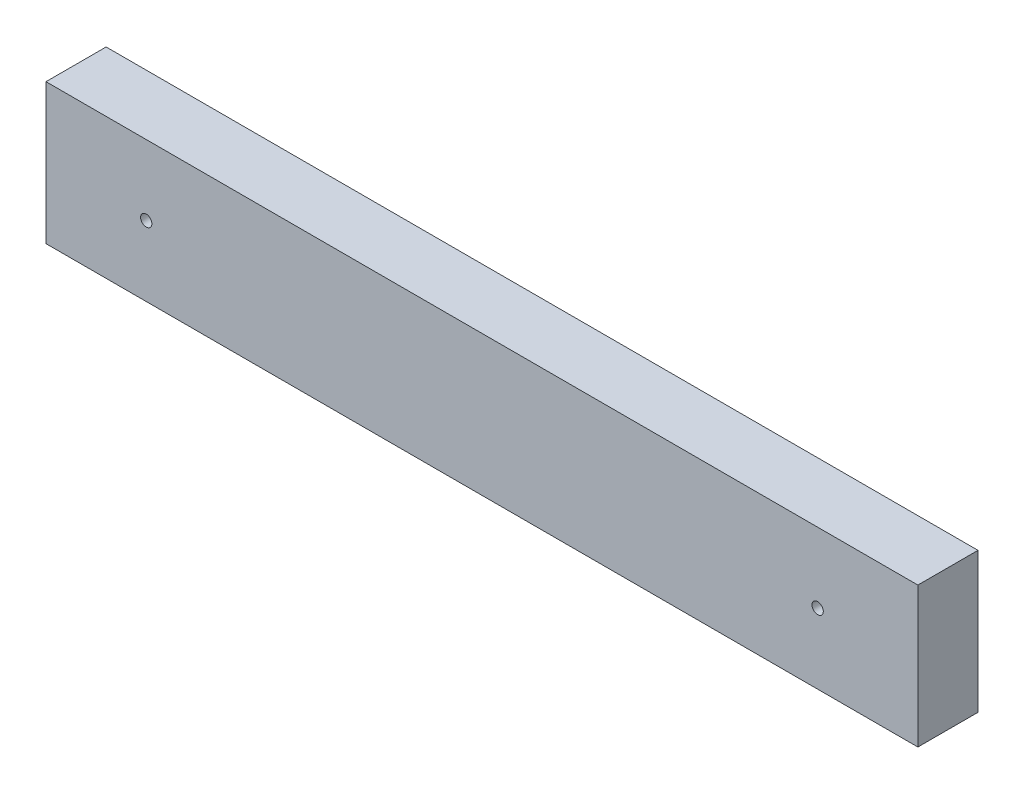
ISO-10303-21;
HEADER;
FILE_DESCRIPTION(('STEP AP214'),'2;1');
FILE_NAME('part.step','',(''),(''),'','','');
FILE_SCHEMA(('AUTOMOTIVE_DESIGN { 1 0 10303 214 1 1 1 1 }'));
ENDSEC;
DATA;
#1=APPLICATION_CONTEXT('core data for automotive mechanical design processes');
#2=APPLICATION_PROTOCOL_DEFINITION('international standard','automotive_design',2000,#1);
#3=PRODUCT_CONTEXT('',#1,'mechanical');
#4=PRODUCT('Part','Part','',(#3));
#5=PRODUCT_RELATED_PRODUCT_CATEGORY('part','',(#4));
#6=PRODUCT_DEFINITION_FORMATION('','',#4);
#7=PRODUCT_DEFINITION_CONTEXT('part definition',#1,'design');
#8=PRODUCT_DEFINITION('design','',#6,#7);
#9=PRODUCT_DEFINITION_SHAPE('','',#8);
#10=(LENGTH_UNIT() NAMED_UNIT(*) SI_UNIT(.MILLI.,.METRE.));
#11=(NAMED_UNIT(*) PLANE_ANGLE_UNIT() SI_UNIT($,.RADIAN.));
#12=(NAMED_UNIT(*) SI_UNIT($,.STERADIAN.) SOLID_ANGLE_UNIT());
#13=UNCERTAINTY_MEASURE_WITH_UNIT(LENGTH_MEASURE(1.E-05),#10,'distance_accuracy_value','');
#14=(GEOMETRIC_REPRESENTATION_CONTEXT(3) GLOBAL_UNCERTAINTY_ASSIGNED_CONTEXT((#13)) GLOBAL_UNIT_ASSIGNED_CONTEXT((#10,
#11,#12)) REPRESENTATION_CONTEXT('',''));
#15=CARTESIAN_POINT('',(0.,0.,0.));
#16=DIRECTION('',(0.,0.,1.));
#17=DIRECTION('',(1.,0.,0.));
#18=AXIS2_PLACEMENT_3D('',#15,#16,#17);
#19=CARTESIAN_POINT('',(552.45,0.,0.));
#20=DIRECTION('',(0.,0.,-1.));
#21=DIRECTION('',(0.,1.,0.));
#22=AXIS2_PLACEMENT_3D('',#19,#20,#21);
#23=PLANE('',#22);
#24=CARTESIAN_POINT('',(63.5,44.45,0.));
#25=DIRECTION('',(0.,0.,1.));
#26=DIRECTION('',(1.,0.,0.));
#27=AXIS2_PLACEMENT_3D('',#24,#25,#26);
#28=CIRCLE('',#27,3.57187500000001);
#29=CARTESIAN_POINT('',(67.071875,44.45,0.));
#30=VERTEX_POINT('',#29);
#31=EDGE_CURVE('E115',#30,#30,#28,.T.);
#32=ORIENTED_EDGE('',*,*,#31,.F.);
#33=EDGE_LOOP('',(#32));
#34=FACE_BOUND('',#33,.T.);
#35=CARTESIAN_POINT('',(488.95,44.45,0.));
#36=DIRECTION('',(0.,0.,1.));
#37=DIRECTION('',(1.,0.,0.));
#38=AXIS2_PLACEMENT_3D('',#35,#36,#37);
#39=CIRCLE('',#38,3.57187499999998);
#40=CARTESIAN_POINT('',(492.521875,44.45,0.));
#41=VERTEX_POINT('',#40);
#42=EDGE_CURVE('E109',#41,#41,#39,.T.);
#43=ORIENTED_EDGE('',*,*,#42,.F.);
#44=EDGE_LOOP('',(#43));
#45=FACE_BOUND('',#44,.T.);
#46=DIRECTION('',(0.,-1.,0.));
#47=VECTOR('',#46,1.);
#48=CARTESIAN_POINT('',(0.,0.,0.));
#49=LINE('',#48,#47);
#50=CARTESIAN_POINT('',(0.,88.9,0.));
#51=VERTEX_POINT('',#50);
#52=CARTESIAN_POINT('',(0.,0.,0.));
#53=VERTEX_POINT('',#52);
#54=EDGE_CURVE('E95',#51,#53,#49,.T.);
#55=ORIENTED_EDGE('',*,*,#54,.T.);
#56=DIRECTION('',(-1.,0.,0.));
#57=VECTOR('',#56,1.);
#58=CARTESIAN_POINT('',(552.45,0.,0.));
#59=LINE('',#58,#57);
#60=CARTESIAN_POINT('',(552.45,0.,0.));
#61=VERTEX_POINT('',#60);
#62=EDGE_CURVE('E11',#61,#53,#59,.T.);
#63=ORIENTED_EDGE('',*,*,#62,.F.);
#64=DIRECTION('',(0.,-1.,0.));
#65=VECTOR('',#64,1.);
#66=CARTESIAN_POINT('',(552.45,0.,0.));
#67=LINE('',#66,#65);
#68=CARTESIAN_POINT('',(552.45,88.9,0.));
#69=VERTEX_POINT('',#68);
#70=EDGE_CURVE('E83',#69,#61,#67,.T.);
#71=ORIENTED_EDGE('',*,*,#70,.F.);
#72=DIRECTION('',(-1.,0.,0.));
#73=VECTOR('',#72,1.);
#74=CARTESIAN_POINT('',(552.45,88.9,0.));
#75=LINE('',#74,#73);
#76=EDGE_CURVE('E91',#69,#51,#75,.T.);
#77=ORIENTED_EDGE('',*,*,#76,.T.);
#78=EDGE_LOOP('',(#55,#63,#71,#77));
#79=FACE_BOUND('',#78,.T.);
#80=ADVANCED_FACE('F32',(#34,#45,#79),#23,.F.);
#81=CARTESIAN_POINT('',(552.45,0.,0.));
#82=DIRECTION('',(0.,1.,0.));
#83=DIRECTION('',(0.,0.,1.));
#84=AXIS2_PLACEMENT_3D('',#81,#82,#83);
#85=PLANE('',#84);
#86=DIRECTION('',(0.,0.,-1.));
#87=VECTOR('',#86,1.);
#88=CARTESIAN_POINT('',(0.,0.,0.));
#89=LINE('',#88,#87);
#90=CARTESIAN_POINT('',(0.,0.,-38.1));
#91=VERTEX_POINT('',#90);
#92=EDGE_CURVE('E87',#53,#91,#89,.T.);
#93=ORIENTED_EDGE('',*,*,#92,.T.);
#94=DIRECTION('',(-1.,0.,0.));
#95=VECTOR('',#94,1.);
#96=CARTESIAN_POINT('',(552.45,0.,-38.1));
#97=LINE('',#96,#95);
#98=CARTESIAN_POINT('',(552.45,0.,-38.1));
#99=VERTEX_POINT('',#98);
#100=EDGE_CURVE('E40',#99,#91,#97,.T.);
#101=ORIENTED_EDGE('',*,*,#100,.F.);
#102=DIRECTION('',(0.,0.,-1.));
#103=VECTOR('',#102,1.);
#104=CARTESIAN_POINT('',(552.45,0.,0.));
#105=LINE('',#104,#103);
#106=EDGE_CURVE('E78',#61,#99,#105,.T.);
#107=ORIENTED_EDGE('',*,*,#106,.F.);
#108=ORIENTED_EDGE('',*,*,#62,.T.);
#109=EDGE_LOOP('',(#93,#101,#107,#108));
#110=FACE_BOUND('',#109,.T.);
#111=ADVANCED_FACE('F86',(#110),#85,.F.);
#112=CARTESIAN_POINT('',(552.45,0.,-38.1));
#113=DIRECTION('',(0.,0.,1.));
#114=DIRECTION('',(0.,-1.,0.));
#115=AXIS2_PLACEMENT_3D('',#112,#113,#114);
#116=PLANE('',#115);
#117=CARTESIAN_POINT('',(63.5,44.45,-38.1));
#118=DIRECTION('',(0.,0.,1.));
#119=DIRECTION('',(1.,0.,0.));
#120=AXIS2_PLACEMENT_3D('',#117,#118,#119);
#121=CIRCLE('',#120,3.57187500000001);
#122=CARTESIAN_POINT('',(67.071875,44.45,-38.1));
#123=VERTEX_POINT('',#122);
#124=EDGE_CURVE('E98',#123,#123,#121,.T.);
#125=ORIENTED_EDGE('',*,*,#124,.T.);
#126=EDGE_LOOP('',(#125));
#127=FACE_BOUND('',#126,.T.);
#128=CARTESIAN_POINT('',(488.95,44.45,-38.1));
#129=DIRECTION('',(0.,0.,1.));
#130=DIRECTION('',(1.,0.,0.));
#131=AXIS2_PLACEMENT_3D('',#128,#129,#130);
#132=CIRCLE('',#131,3.57187499999998);
#133=CARTESIAN_POINT('',(492.521875,44.45,-38.1));
#134=VERTEX_POINT('',#133);
#135=EDGE_CURVE('E112',#134,#134,#132,.T.);
#136=ORIENTED_EDGE('',*,*,#135,.T.);
#137=EDGE_LOOP('',(#136));
#138=FACE_BOUND('',#137,.T.);
#139=DIRECTION('',(0.,1.,0.));
#140=VECTOR('',#139,1.);
#141=CARTESIAN_POINT('',(0.,0.,-38.1));
#142=LINE('',#141,#140);
#143=CARTESIAN_POINT('',(0.,88.9,-38.1));
#144=VERTEX_POINT('',#143);
#145=EDGE_CURVE('E65',#91,#144,#142,.T.);
#146=ORIENTED_EDGE('',*,*,#145,.T.);
#147=DIRECTION('',(-1.,0.,0.));
#148=VECTOR('',#147,1.);
#149=CARTESIAN_POINT('',(552.45,88.9,-38.1));
#150=LINE('',#149,#148);
#151=CARTESIAN_POINT('',(552.45,88.9,-38.1));
#152=VERTEX_POINT('',#151);
#153=EDGE_CURVE('E88',#152,#144,#150,.T.);
#154=ORIENTED_EDGE('',*,*,#153,.F.);
#155=DIRECTION('',(0.,1.,0.));
#156=VECTOR('',#155,1.);
#157=CARTESIAN_POINT('',(552.45,0.,-38.1));
#158=LINE('',#157,#156);
#159=EDGE_CURVE('E81',#99,#152,#158,.T.);
#160=ORIENTED_EDGE('',*,*,#159,.F.);
#161=ORIENTED_EDGE('',*,*,#100,.T.);
#162=EDGE_LOOP('',(#146,#154,#160,#161));
#163=FACE_BOUND('',#162,.T.);
#164=ADVANCED_FACE('F89',(#127,#138,#163),#116,.F.);
#165=CARTESIAN_POINT('',(552.45,88.9,0.));
#166=DIRECTION('',(0.,-1.,0.));
#167=DIRECTION('',(0.,0.,-1.));
#168=AXIS2_PLACEMENT_3D('',#165,#166,#167);
#169=PLANE('',#168);
#170=DIRECTION('',(0.,0.,1.));
#171=VECTOR('',#170,1.);
#172=CARTESIAN_POINT('',(0.,88.9,0.));
#173=LINE('',#172,#171);
#174=EDGE_CURVE('E71',#144,#51,#173,.T.);
#175=ORIENTED_EDGE('',*,*,#174,.T.);
#176=ORIENTED_EDGE('',*,*,#76,.F.);
#177=DIRECTION('',(0.,0.,1.));
#178=VECTOR('',#177,1.);
#179=CARTESIAN_POINT('',(552.45,88.9,0.));
#180=LINE('',#179,#178);
#181=EDGE_CURVE('E48',#152,#69,#180,.T.);
#182=ORIENTED_EDGE('',*,*,#181,.F.);
#183=ORIENTED_EDGE('',*,*,#153,.T.);
#184=EDGE_LOOP('',(#175,#176,#182,#183));
#185=FACE_BOUND('',#184,.T.);
#186=ADVANCED_FACE('F103',(#185),#169,.F.);
#187=CARTESIAN_POINT('',(552.45,0.,0.));
#188=DIRECTION('',(-1.,0.,0.));
#189=DIRECTION('',(0.,0.,1.));
#190=AXIS2_PLACEMENT_3D('',#187,#188,#189);
#191=PLANE('',#190);
#192=ORIENTED_EDGE('',*,*,#70,.T.);
#193=ORIENTED_EDGE('',*,*,#106,.T.);
#194=ORIENTED_EDGE('',*,*,#159,.T.);
#195=ORIENTED_EDGE('',*,*,#181,.T.);
#196=EDGE_LOOP('',(#192,#193,#194,#195));
#197=FACE_BOUND('',#196,.T.);
#198=ADVANCED_FACE('F79',(#197),#191,.F.);
#199=CARTESIAN_POINT('',(0.,0.,0.));
#200=DIRECTION('',(-1.,0.,0.));
#201=DIRECTION('',(0.,0.,1.));
#202=AXIS2_PLACEMENT_3D('',#199,#200,#201);
#203=PLANE('',#202);
#204=ORIENTED_EDGE('',*,*,#54,.F.);
#205=ORIENTED_EDGE('',*,*,#174,.F.);
#206=ORIENTED_EDGE('',*,*,#145,.F.);
#207=ORIENTED_EDGE('',*,*,#92,.F.);
#208=EDGE_LOOP('',(#204,#205,#206,#207));
#209=FACE_BOUND('',#208,.T.);
#210=ADVANCED_FACE('F106',(#209),#203,.T.);
#211=CARTESIAN_POINT('',(488.95,44.45,-38.1));
#212=DIRECTION('',(0.,0.,1.));
#213=DIRECTION('',(1.,0.,0.));
#214=AXIS2_PLACEMENT_3D('',#211,#212,#213);
#215=CYLINDRICAL_SURFACE('',#214,3.57187499999998);
#216=CARTESIAN_POINT('',(492.521875,44.45,-38.1));
#217=CARTESIAN_POINT('',(492.521875,44.45,-37.703125));
#218=CARTESIAN_POINT('',(492.521875,44.45,-37.30625));
#219=CARTESIAN_POINT('',(492.521875,44.45,-36.5125));
#220=CARTESIAN_POINT('',(492.521875,44.45,-36.115625));
#221=CARTESIAN_POINT('',(492.521875,44.45,-35.321875));
#222=CARTESIAN_POINT('',(492.521875,44.45,-34.925));
#223=CARTESIAN_POINT('',(492.521875,44.45,-34.13125));
#224=CARTESIAN_POINT('',(492.521875,44.45,-33.734375));
#225=CARTESIAN_POINT('',(492.521875,44.45,-32.940625));
#226=CARTESIAN_POINT('',(492.521875,44.45,-32.54375));
#227=CARTESIAN_POINT('',(492.521875,44.45,-31.75));
#228=CARTESIAN_POINT('',(492.521875,44.45,-31.353125));
#229=CARTESIAN_POINT('',(492.521875,44.45,-30.559375));
#230=CARTESIAN_POINT('',(492.521875,44.45,-30.1625));
#231=CARTESIAN_POINT('',(492.521875,44.45,-29.36875));
#232=CARTESIAN_POINT('',(492.521875,44.45,-28.971875));
#233=CARTESIAN_POINT('',(492.521875,44.45,-28.178125));
#234=CARTESIAN_POINT('',(492.521875,44.45,-27.78125));
#235=CARTESIAN_POINT('',(492.521875,44.45,-26.9875));
#236=CARTESIAN_POINT('',(492.521875,44.45,-26.590625));
#237=CARTESIAN_POINT('',(492.521875,44.45,-25.796875));
#238=CARTESIAN_POINT('',(492.521875,44.45,-25.4));
#239=CARTESIAN_POINT('',(492.521875,44.45,-24.60625));
#240=CARTESIAN_POINT('',(492.521875,44.45,-24.209375));
#241=CARTESIAN_POINT('',(492.521875,44.45,-23.415625));
#242=CARTESIAN_POINT('',(492.521875,44.45,-23.01875));
#243=CARTESIAN_POINT('',(492.521875,44.45,-22.225));
#244=CARTESIAN_POINT('',(492.521875,44.45,-21.828125));
#245=CARTESIAN_POINT('',(492.521875,44.45,-21.034375));
#246=CARTESIAN_POINT('',(492.521875,44.45,-20.6375));
#247=CARTESIAN_POINT('',(492.521875,44.45,-19.84375));
#248=CARTESIAN_POINT('',(492.521875,44.45,-19.446875));
#249=CARTESIAN_POINT('',(492.521875,44.45,-18.653125));
#250=CARTESIAN_POINT('',(492.521875,44.45,-18.25625));
#251=CARTESIAN_POINT('',(492.521875,44.45,-17.4625));
#252=CARTESIAN_POINT('',(492.521875,44.45,-17.065625));
#253=CARTESIAN_POINT('',(492.521875,44.45,-16.271875));
#254=CARTESIAN_POINT('',(492.521875,44.45,-15.875));
#255=CARTESIAN_POINT('',(492.521875,44.45,-15.08125));
#256=CARTESIAN_POINT('',(492.521875,44.45,-14.684375));
#257=CARTESIAN_POINT('',(492.521875,44.45,-13.890625));
#258=CARTESIAN_POINT('',(492.521875,44.45,-13.49375));
#259=CARTESIAN_POINT('',(492.521875,44.45,-12.7));
#260=CARTESIAN_POINT('',(492.521875,44.45,-12.303125));
#261=CARTESIAN_POINT('',(492.521875,44.45,-11.509375));
#262=CARTESIAN_POINT('',(492.521875,44.45,-11.1125));
#263=CARTESIAN_POINT('',(492.521875,44.45,-10.31875));
#264=CARTESIAN_POINT('',(492.521875,44.45,-9.921875));
#265=CARTESIAN_POINT('',(492.521875,44.45,-9.128125));
#266=CARTESIAN_POINT('',(492.521875,44.45,-8.73125));
#267=CARTESIAN_POINT('',(492.521875,44.45,-7.9375));
#268=CARTESIAN_POINT('',(492.521875,44.45,-7.540625));
#269=CARTESIAN_POINT('',(492.521875,44.45,-6.746875));
#270=CARTESIAN_POINT('',(492.521875,44.45,-6.35));
#271=CARTESIAN_POINT('',(492.521875,44.45,-5.55625));
#272=CARTESIAN_POINT('',(492.521875,44.45,-5.159375));
#273=CARTESIAN_POINT('',(492.521875,44.45,-4.365625));
#274=CARTESIAN_POINT('',(492.521875,44.45,-3.96875));
#275=CARTESIAN_POINT('',(492.521875,44.45,-3.175));
#276=CARTESIAN_POINT('',(492.521875,44.45,-2.778125));
#277=CARTESIAN_POINT('',(492.521875,44.45,-1.984375));
#278=CARTESIAN_POINT('',(492.521875,44.45,-1.5875));
#279=CARTESIAN_POINT('',(492.521875,44.45,-0.79375));
#280=CARTESIAN_POINT('',(492.521875,44.45,-0.396875));
#281=CARTESIAN_POINT('',(492.521875,44.45,0.));
#282=B_SPLINE_CURVE_WITH_KNOTS('',3,(#216,#217,#218,#219,#220,#221,#222,#223,#224,#225,#226,
#227,#228,#229,#230,#231,#232,#233,#234,#235,#236,#237,#238,#239,#240,#241,#242,#243,#244,#245,
#246,#247,#248,#249,#250,#251,#252,#253,#254,#255,#256,#257,#258,#259,#260,#261,#262,#263,#264,
#265,#266,#267,#268,#269,#270,#271,#272,#273,#274,#275,#276,#277,#278,#279,#280,#281),
.UNSPECIFIED.,.F.,.F.,(4,2,2,2,2,2,2,2,2,2,2,2,2,2,2,2,2,2,2,2,2,2,2,2,2,2,2,2,2,2,2,2,4),(0.,
1.19062499999999,2.38124999999999,3.571875,4.7625,5.953125,7.14375,8.334375,9.525,10.715625,
11.90625,13.096875,14.2875,15.478125,16.66875,17.859375,19.05,20.240625,21.43125,22.621875,
23.8125,25.003125,26.19375,27.384375,28.575,29.765625,30.95625,32.146875,33.3375,34.528125,
35.71875,36.909375,38.1),.UNSPECIFIED.);
#283=EDGE_CURVE('BSEAM126',#134,#41,#282,.T.);
#284=ORIENTED_EDGE('',*,*,#135,.F.);
#285=ORIENTED_EDGE('',*,*,#42,.T.);
#286=ORIENTED_EDGE('',*,*,#283,.T.);
#287=ORIENTED_EDGE('',*,*,#283,.F.);
#288=EDGE_LOOP('',(#284,#286,#285,#287));
#289=FACE_BOUND('',#288,.T.);
#290=ADVANCED_FACE('F126',(#289),#215,.F.);
#291=CARTESIAN_POINT('',(63.5,44.45,-38.1));
#292=DIRECTION('',(0.,0.,1.));
#293=DIRECTION('',(1.,0.,0.));
#294=AXIS2_PLACEMENT_3D('',#291,#292,#293);
#295=CYLINDRICAL_SURFACE('',#294,3.57187500000001);
#296=CARTESIAN_POINT('',(67.071875,44.45,-38.1));
#297=CARTESIAN_POINT('',(67.071875,44.45,-37.703125));
#298=CARTESIAN_POINT('',(67.071875,44.45,-37.30625));
#299=CARTESIAN_POINT('',(67.071875,44.45,-36.5125));
#300=CARTESIAN_POINT('',(67.071875,44.45,-36.115625));
#301=CARTESIAN_POINT('',(67.071875,44.45,-35.321875));
#302=CARTESIAN_POINT('',(67.071875,44.45,-34.925));
#303=CARTESIAN_POINT('',(67.071875,44.45,-34.13125));
#304=CARTESIAN_POINT('',(67.071875,44.45,-33.734375));
#305=CARTESIAN_POINT('',(67.071875,44.45,-32.940625));
#306=CARTESIAN_POINT('',(67.071875,44.45,-32.54375));
#307=CARTESIAN_POINT('',(67.071875,44.45,-31.75));
#308=CARTESIAN_POINT('',(67.071875,44.45,-31.353125));
#309=CARTESIAN_POINT('',(67.071875,44.45,-30.559375));
#310=CARTESIAN_POINT('',(67.071875,44.45,-30.1625));
#311=CARTESIAN_POINT('',(67.071875,44.45,-29.36875));
#312=CARTESIAN_POINT('',(67.071875,44.45,-28.971875));
#313=CARTESIAN_POINT('',(67.071875,44.45,-28.178125));
#314=CARTESIAN_POINT('',(67.071875,44.45,-27.78125));
#315=CARTESIAN_POINT('',(67.071875,44.45,-26.9875));
#316=CARTESIAN_POINT('',(67.071875,44.45,-26.590625));
#317=CARTESIAN_POINT('',(67.071875,44.45,-25.796875));
#318=CARTESIAN_POINT('',(67.071875,44.45,-25.4));
#319=CARTESIAN_POINT('',(67.071875,44.45,-24.60625));
#320=CARTESIAN_POINT('',(67.071875,44.45,-24.209375));
#321=CARTESIAN_POINT('',(67.071875,44.45,-23.415625));
#322=CARTESIAN_POINT('',(67.071875,44.45,-23.01875));
#323=CARTESIAN_POINT('',(67.071875,44.45,-22.225));
#324=CARTESIAN_POINT('',(67.071875,44.45,-21.828125));
#325=CARTESIAN_POINT('',(67.071875,44.45,-21.034375));
#326=CARTESIAN_POINT('',(67.071875,44.45,-20.6375));
#327=CARTESIAN_POINT('',(67.071875,44.45,-19.84375));
#328=CARTESIAN_POINT('',(67.071875,44.45,-19.446875));
#329=CARTESIAN_POINT('',(67.071875,44.45,-18.653125));
#330=CARTESIAN_POINT('',(67.071875,44.45,-18.25625));
#331=CARTESIAN_POINT('',(67.071875,44.45,-17.4625));
#332=CARTESIAN_POINT('',(67.071875,44.45,-17.065625));
#333=CARTESIAN_POINT('',(67.071875,44.45,-16.271875));
#334=CARTESIAN_POINT('',(67.071875,44.45,-15.875));
#335=CARTESIAN_POINT('',(67.071875,44.45,-15.08125));
#336=CARTESIAN_POINT('',(67.071875,44.45,-14.684375));
#337=CARTESIAN_POINT('',(67.071875,44.45,-13.890625));
#338=CARTESIAN_POINT('',(67.071875,44.45,-13.49375));
#339=CARTESIAN_POINT('',(67.071875,44.45,-12.7));
#340=CARTESIAN_POINT('',(67.071875,44.45,-12.303125));
#341=CARTESIAN_POINT('',(67.071875,44.45,-11.509375));
#342=CARTESIAN_POINT('',(67.071875,44.45,-11.1125));
#343=CARTESIAN_POINT('',(67.071875,44.45,-10.31875));
#344=CARTESIAN_POINT('',(67.071875,44.45,-9.921875));
#345=CARTESIAN_POINT('',(67.071875,44.45,-9.128125));
#346=CARTESIAN_POINT('',(67.071875,44.45,-8.73125));
#347=CARTESIAN_POINT('',(67.071875,44.45,-7.9375));
#348=CARTESIAN_POINT('',(67.071875,44.45,-7.540625));
#349=CARTESIAN_POINT('',(67.071875,44.45,-6.746875));
#350=CARTESIAN_POINT('',(67.071875,44.45,-6.35));
#351=CARTESIAN_POINT('',(67.071875,44.45,-5.55625));
#352=CARTESIAN_POINT('',(67.071875,44.45,-5.159375));
#353=CARTESIAN_POINT('',(67.071875,44.45,-4.365625));
#354=CARTESIAN_POINT('',(67.071875,44.45,-3.96875));
#355=CARTESIAN_POINT('',(67.071875,44.45,-3.175));
#356=CARTESIAN_POINT('',(67.071875,44.45,-2.778125));
#357=CARTESIAN_POINT('',(67.071875,44.45,-1.984375));
#358=CARTESIAN_POINT('',(67.071875,44.45,-1.5875));
#359=CARTESIAN_POINT('',(67.071875,44.45,-0.79375));
#360=CARTESIAN_POINT('',(67.071875,44.45,-0.396875));
#361=CARTESIAN_POINT('',(67.071875,44.45,0.));
#362=B_SPLINE_CURVE_WITH_KNOTS('',3,(#296,#297,#298,#299,#300,#301,#302,#303,#304,#305,#306,
#307,#308,#309,#310,#311,#312,#313,#314,#315,#316,#317,#318,#319,#320,#321,#322,#323,#324,#325,
#326,#327,#328,#329,#330,#331,#332,#333,#334,#335,#336,#337,#338,#339,#340,#341,#342,#343,#344,
#345,#346,#347,#348,#349,#350,#351,#352,#353,#354,#355,#356,#357,#358,#359,#360,#361),
.UNSPECIFIED.,.F.,.F.,(4,2,2,2,2,2,2,2,2,2,2,2,2,2,2,2,2,2,2,2,2,2,2,2,2,2,2,2,2,2,2,2,4),(0.,
1.19062499999999,2.38124999999999,3.571875,4.7625,5.953125,7.14375,8.334375,9.525,10.715625,
11.90625,13.096875,14.2875,15.478125,16.66875,17.859375,19.05,20.240625,21.43125,22.621875,
23.8125,25.003125,26.19375,27.384375,28.575,29.765625,30.95625,32.146875,33.3375,34.528125,
35.71875,36.909375,38.1),.UNSPECIFIED.);
#363=EDGE_CURVE('BSEAM123',#123,#30,#362,.T.);
#364=ORIENTED_EDGE('',*,*,#124,.F.);
#365=ORIENTED_EDGE('',*,*,#31,.T.);
#366=ORIENTED_EDGE('',*,*,#363,.T.);
#367=ORIENTED_EDGE('',*,*,#363,.F.);
#368=EDGE_LOOP('',(#364,#366,#365,#367));
#369=FACE_BOUND('',#368,.T.);
#370=ADVANCED_FACE('F123',(#369),#295,.F.);
#371=CLOSED_SHELL('',(#80,#111,#164,#186,#198,#210,#290,#370));
#372=MANIFOLD_SOLID_BREP('B2',#371);
#373=ADVANCED_BREP_SHAPE_REPRESENTATION('',(#18,#372),#14);
#374=SHAPE_DEFINITION_REPRESENTATION(#9,#373);
ENDSEC;
END-ISO-10303-21;
